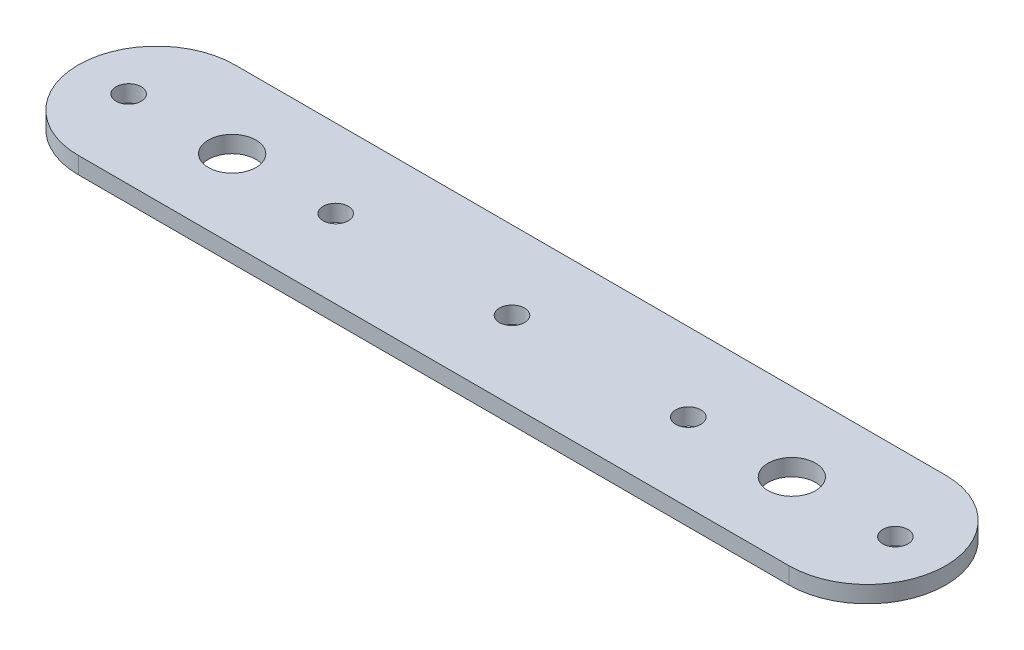
ISO-10303-21;
HEADER;
FILE_DESCRIPTION(('STEP AP214'),'2;1');
FILE_NAME('part.step','',(''),(''),'','','');
FILE_SCHEMA(('AUTOMOTIVE_DESIGN { 1 0 10303 214 1 1 1 1 }'));
ENDSEC;
DATA;
#1=APPLICATION_CONTEXT('core data for automotive mechanical design processes');
#2=APPLICATION_PROTOCOL_DEFINITION('international standard','automotive_design',2000,#1);
#3=PRODUCT_CONTEXT('',#1,'mechanical');
#4=PRODUCT('Part','Part','',(#3));
#5=PRODUCT_RELATED_PRODUCT_CATEGORY('part','',(#4));
#6=PRODUCT_DEFINITION_FORMATION('','',#4);
#7=PRODUCT_DEFINITION_CONTEXT('part definition',#1,'design');
#8=PRODUCT_DEFINITION('design','',#6,#7);
#9=PRODUCT_DEFINITION_SHAPE('','',#8);
#10=(LENGTH_UNIT() NAMED_UNIT(*) SI_UNIT(.MILLI.,.METRE.));
#11=(NAMED_UNIT(*) PLANE_ANGLE_UNIT() SI_UNIT($,.RADIAN.));
#12=(NAMED_UNIT(*) SI_UNIT($,.STERADIAN.) SOLID_ANGLE_UNIT());
#13=UNCERTAINTY_MEASURE_WITH_UNIT(LENGTH_MEASURE(1.E-05),#10,'distance_accuracy_value','');
#14=(GEOMETRIC_REPRESENTATION_CONTEXT(3) GLOBAL_UNCERTAINTY_ASSIGNED_CONTEXT((#13)) GLOBAL_UNIT_ASSIGNED_CONTEXT((#10,
#11,#12)) REPRESENTATION_CONTEXT('',''));
#15=CARTESIAN_POINT('',(0.,0.,0.));
#16=DIRECTION('',(0.,0.,1.));
#17=DIRECTION('',(1.,0.,0.));
#18=AXIS2_PLACEMENT_3D('',#15,#16,#17);
#19=CARTESIAN_POINT('',(63.5,0.,0.));
#20=DIRECTION('',(0.,-1.,0.));
#21=DIRECTION('',(0.,0.,-1.));
#22=AXIS2_PLACEMENT_3D('',#19,#20,#21);
#23=CYLINDRICAL_SURFACE('',#22,14.);
#24=DIRECTION('',(0.,1.,0.));
#25=VECTOR('',#24,1.);
#26=CARTESIAN_POINT('',(63.5,0.,14.));
#27=LINE('',#26,#25);
#28=CARTESIAN_POINT('',(63.5,0.,14.));
#29=VERTEX_POINT('',#28);
#30=CARTESIAN_POINT('',(63.5,3.,14.));
#31=VERTEX_POINT('',#30);
#32=EDGE_CURVE('E84',#29,#31,#27,.T.);
#33=ORIENTED_EDGE('',*,*,#32,.F.);
#34=CARTESIAN_POINT('',(63.5,0.,0.));
#35=DIRECTION('',(0.,1.,0.));
#36=DIRECTION('',(0.,0.,1.));
#37=AXIS2_PLACEMENT_3D('',#34,#35,#36);
#38=CIRCLE('',#37,14.);
#39=CARTESIAN_POINT('',(63.5,0.,-14.));
#40=VERTEX_POINT('',#39);
#41=EDGE_CURVE('E42',#40,#29,#38,.F.);
#42=ORIENTED_EDGE('',*,*,#41,.F.);
#43=DIRECTION('',(0.,-1.,0.));
#44=VECTOR('',#43,1.);
#45=CARTESIAN_POINT('',(63.5,3.,-14.));
#46=LINE('',#45,#44);
#47=CARTESIAN_POINT('',(63.5,3.,-14.));
#48=VERTEX_POINT('',#47);
#49=EDGE_CURVE('E107',#48,#40,#46,.T.);
#50=ORIENTED_EDGE('',*,*,#49,.F.);
#51=CARTESIAN_POINT('',(63.5,3.,0.));
#52=DIRECTION('',(0.,1.,0.));
#53=DIRECTION('',(0.,0.,1.));
#54=AXIS2_PLACEMENT_3D('',#51,#52,#53);
#55=CIRCLE('',#54,14.);
#56=EDGE_CURVE('E11',#31,#48,#55,.T.);
#57=ORIENTED_EDGE('',*,*,#56,.F.);
#58=EDGE_LOOP('',(#33,#42,#50,#57));
#59=FACE_BOUND('',#58,.T.);
#60=ADVANCED_FACE('F35',(#59),#23,.T.);
#61=CARTESIAN_POINT('',(-63.5,3.,0.));
#62=DIRECTION('',(0.,-1.,0.));
#63=DIRECTION('',(0.,0.,-1.));
#64=AXIS2_PLACEMENT_3D('',#61,#62,#63);
#65=CYLINDRICAL_SURFACE('',#64,14.);
#66=DIRECTION('',(0.,-1.,0.));
#67=VECTOR('',#66,1.);
#68=CARTESIAN_POINT('',(-63.5,3.,14.));
#69=LINE('',#68,#67);
#70=CARTESIAN_POINT('',(-63.5,3.,14.));
#71=VERTEX_POINT('',#70);
#72=CARTESIAN_POINT('',(-63.5,0.,14.));
#73=VERTEX_POINT('',#72);
#74=EDGE_CURVE('E76',#71,#73,#69,.T.);
#75=ORIENTED_EDGE('',*,*,#74,.F.);
#76=CARTESIAN_POINT('',(-63.5,3.,0.));
#77=DIRECTION('',(0.,1.,0.));
#78=DIRECTION('',(0.,0.,1.));
#79=AXIS2_PLACEMENT_3D('',#76,#77,#78);
#80=CIRCLE('',#79,14.);
#81=CARTESIAN_POINT('',(-63.5,3.,-14.));
#82=VERTEX_POINT('',#81);
#83=EDGE_CURVE('E85',#82,#71,#80,.T.);
#84=ORIENTED_EDGE('',*,*,#83,.F.);
#85=DIRECTION('',(0.,1.,0.));
#86=VECTOR('',#85,1.);
#87=CARTESIAN_POINT('',(-63.5,3.,-14.));
#88=LINE('',#87,#86);
#89=CARTESIAN_POINT('',(-63.5,0.,-14.));
#90=VERTEX_POINT('',#89);
#91=EDGE_CURVE('E79',#90,#82,#88,.T.);
#92=ORIENTED_EDGE('',*,*,#91,.F.);
#93=CARTESIAN_POINT('',(-63.5,0.,0.));
#94=DIRECTION('',(0.,1.,0.));
#95=DIRECTION('',(0.,0.,1.));
#96=AXIS2_PLACEMENT_3D('',#93,#94,#95);
#97=CIRCLE('',#96,14.);
#98=EDGE_CURVE('E73',#73,#90,#97,.F.);
#99=ORIENTED_EDGE('',*,*,#98,.F.);
#100=EDGE_LOOP('',(#75,#84,#92,#99));
#101=FACE_BOUND('',#100,.T.);
#102=ADVANCED_FACE('F75',(#101),#65,.T.);
#103=CARTESIAN_POINT('',(0.,3.,-14.));
#104=DIRECTION('',(0.,0.,-1.));
#105=DIRECTION('',(-1.,0.,0.));
#106=AXIS2_PLACEMENT_3D('',#103,#104,#105);
#107=PLANE('',#106);
#108=DIRECTION('',(1.,0.,0.));
#109=VECTOR('',#108,1.);
#110=CARTESIAN_POINT('',(0.,3.,-14.));
#111=LINE('',#110,#109);
#112=EDGE_CURVE('E95',#82,#48,#111,.T.);
#113=ORIENTED_EDGE('',*,*,#112,.T.);
#114=ORIENTED_EDGE('',*,*,#49,.T.);
#115=DIRECTION('',(1.,0.,0.));
#116=VECTOR('',#115,1.);
#117=CARTESIAN_POINT('',(0.,0.,-14.));
#118=LINE('',#117,#116);
#119=EDGE_CURVE('E96',#90,#40,#118,.T.);
#120=ORIENTED_EDGE('',*,*,#119,.F.);
#121=ORIENTED_EDGE('',*,*,#91,.T.);
#122=EDGE_LOOP('',(#113,#114,#120,#121));
#123=FACE_BOUND('',#122,.T.);
#124=ADVANCED_FACE('F109',(#123),#107,.T.);
#125=CARTESIAN_POINT('',(0.,3.,14.));
#126=DIRECTION('',(0.,0.,-1.));
#127=DIRECTION('',(-1.,0.,0.));
#128=AXIS2_PLACEMENT_3D('',#125,#126,#127);
#129=PLANE('',#128);
#130=DIRECTION('',(1.,0.,0.));
#131=VECTOR('',#130,1.);
#132=CARTESIAN_POINT('',(0.,0.,14.));
#133=LINE('',#132,#131);
#134=EDGE_CURVE('E91',#73,#29,#133,.T.);
#135=ORIENTED_EDGE('',*,*,#134,.T.);
#136=ORIENTED_EDGE('',*,*,#32,.T.);
#137=DIRECTION('',(1.,0.,0.));
#138=VECTOR('',#137,1.);
#139=CARTESIAN_POINT('',(0.,3.,14.));
#140=LINE('',#139,#138);
#141=EDGE_CURVE('E92',#71,#31,#140,.T.);
#142=ORIENTED_EDGE('',*,*,#141,.F.);
#143=ORIENTED_EDGE('',*,*,#74,.T.);
#144=EDGE_LOOP('',(#135,#136,#142,#143));
#145=FACE_BOUND('',#144,.T.);
#146=ADVANCED_FACE('F89',(#145),#129,.F.);
#147=CARTESIAN_POINT('',(0.,3.,0.));
#148=DIRECTION('',(0.,1.,0.));
#149=DIRECTION('',(0.,0.,1.));
#150=AXIS2_PLACEMENT_3D('',#147,#148,#149);
#151=PLANE('',#150);
#152=CARTESIAN_POINT('',(68.5,3.,0.));
#153=DIRECTION('',(0.,1.,0.));
#154=DIRECTION('',(0.,0.,1.));
#155=AXIS2_PLACEMENT_3D('',#152,#153,#154);
#156=CIRCLE('',#155,2.25);
#157=CARTESIAN_POINT('',(68.5,3.,2.25));
#158=VERTEX_POINT('',#157);
#159=EDGE_CURVE('E150',#158,#158,#156,.T.);
#160=ORIENTED_EDGE('',*,*,#159,.F.);
#161=EDGE_LOOP('',(#160));
#162=FACE_BOUND('',#161,.T.);
#163=CARTESIAN_POINT('',(31.5,3.,0.));
#164=DIRECTION('',(0.,1.,0.));
#165=DIRECTION('',(0.,0.,1.));
#166=AXIS2_PLACEMENT_3D('',#163,#164,#165);
#167=CIRCLE('',#166,2.25);
#168=CARTESIAN_POINT('',(31.5,3.,2.25));
#169=VERTEX_POINT('',#168);
#170=EDGE_CURVE('E144',#169,#169,#167,.T.);
#171=ORIENTED_EDGE('',*,*,#170,.F.);
#172=EDGE_LOOP('',(#171));
#173=FACE_BOUND('',#172,.T.);
#174=CARTESIAN_POINT('',(-31.5,3.,0.));
#175=DIRECTION('',(0.,1.,0.));
#176=DIRECTION('',(0.,0.,1.));
#177=AXIS2_PLACEMENT_3D('',#174,#175,#176);
#178=CIRCLE('',#177,2.25);
#179=CARTESIAN_POINT('',(-31.5,3.,2.25));
#180=VERTEX_POINT('',#179);
#181=EDGE_CURVE('E138',#180,#180,#178,.T.);
#182=ORIENTED_EDGE('',*,*,#181,.F.);
#183=EDGE_LOOP('',(#182));
#184=FACE_BOUND('',#183,.T.);
#185=CARTESIAN_POINT('',(-68.5,3.,0.));
#186=DIRECTION('',(0.,1.,0.));
#187=DIRECTION('',(0.,0.,1.));
#188=AXIS2_PLACEMENT_3D('',#185,#186,#187);
#189=CIRCLE('',#188,2.25);
#190=CARTESIAN_POINT('',(-68.5,3.,2.25));
#191=VERTEX_POINT('',#190);
#192=EDGE_CURVE('E132',#191,#191,#189,.T.);
#193=ORIENTED_EDGE('',*,*,#192,.F.);
#194=EDGE_LOOP('',(#193));
#195=FACE_BOUND('',#194,.T.);
#196=CARTESIAN_POINT('',(0.,3.,0.));
#197=DIRECTION('',(0.,1.,0.));
#198=DIRECTION('',(0.,0.,1.));
#199=AXIS2_PLACEMENT_3D('',#196,#197,#198);
#200=CIRCLE('',#199,2.25);
#201=CARTESIAN_POINT('',(0.,3.,2.25));
#202=VERTEX_POINT('',#201);
#203=EDGE_CURVE('E126',#202,#202,#200,.T.);
#204=ORIENTED_EDGE('',*,*,#203,.F.);
#205=EDGE_LOOP('',(#204));
#206=FACE_BOUND('',#205,.T.);
#207=CARTESIAN_POINT('',(50.,3.,0.));
#208=DIRECTION('',(0.,1.,0.));
#209=DIRECTION('',(0.,0.,1.));
#210=AXIS2_PLACEMENT_3D('',#207,#208,#209);
#211=CIRCLE('',#210,4.25000000000001);
#212=CARTESIAN_POINT('',(50.,3.,4.25000000000001));
#213=VERTEX_POINT('',#212);
#214=EDGE_CURVE('E120',#213,#213,#211,.T.);
#215=ORIENTED_EDGE('',*,*,#214,.F.);
#216=EDGE_LOOP('',(#215));
#217=FACE_BOUND('',#216,.T.);
#218=CARTESIAN_POINT('',(-50.,3.,0.));
#219=DIRECTION('',(0.,1.,0.));
#220=DIRECTION('',(0.,0.,1.));
#221=AXIS2_PLACEMENT_3D('',#218,#219,#220);
#222=CIRCLE('',#221,4.25000000000001);
#223=CARTESIAN_POINT('',(-50.,3.,4.25000000000001));
#224=VERTEX_POINT('',#223);
#225=EDGE_CURVE('E114',#224,#224,#222,.T.);
#226=ORIENTED_EDGE('',*,*,#225,.F.);
#227=EDGE_LOOP('',(#226));
#228=FACE_BOUND('',#227,.T.);
#229=ORIENTED_EDGE('',*,*,#141,.T.);
#230=ORIENTED_EDGE('',*,*,#56,.T.);
#231=ORIENTED_EDGE('',*,*,#112,.F.);
#232=ORIENTED_EDGE('',*,*,#83,.T.);
#233=EDGE_LOOP('',(#229,#230,#231,#232));
#234=FACE_BOUND('',#233,.T.);
#235=ADVANCED_FACE('F110',(#162,#173,#184,#195,#206,#217,#228,#234),#151,.T.);
#236=CARTESIAN_POINT('',(0.,0.,0.));
#237=DIRECTION('',(0.,1.,0.));
#238=DIRECTION('',(0.,0.,1.));
#239=AXIS2_PLACEMENT_3D('',#236,#237,#238);
#240=PLANE('',#239);
#241=CARTESIAN_POINT('',(68.5,0.,0.));
#242=DIRECTION('',(0.,1.,0.));
#243=DIRECTION('',(0.,0.,1.));
#244=AXIS2_PLACEMENT_3D('',#241,#242,#243);
#245=CIRCLE('',#244,2.25);
#246=CARTESIAN_POINT('',(68.5,0.,2.25));
#247=VERTEX_POINT('',#246);
#248=EDGE_CURVE('E147',#247,#247,#245,.F.);
#249=ORIENTED_EDGE('',*,*,#248,.F.);
#250=EDGE_LOOP('',(#249));
#251=FACE_BOUND('',#250,.T.);
#252=CARTESIAN_POINT('',(31.5,0.,0.));
#253=DIRECTION('',(0.,1.,0.));
#254=DIRECTION('',(0.,0.,1.));
#255=AXIS2_PLACEMENT_3D('',#252,#253,#254);
#256=CIRCLE('',#255,2.25);
#257=CARTESIAN_POINT('',(31.5,0.,2.25));
#258=VERTEX_POINT('',#257);
#259=EDGE_CURVE('E141',#258,#258,#256,.F.);
#260=ORIENTED_EDGE('',*,*,#259,.F.);
#261=EDGE_LOOP('',(#260));
#262=FACE_BOUND('',#261,.T.);
#263=CARTESIAN_POINT('',(-31.5,0.,0.));
#264=DIRECTION('',(0.,1.,0.));
#265=DIRECTION('',(0.,0.,1.));
#266=AXIS2_PLACEMENT_3D('',#263,#264,#265);
#267=CIRCLE('',#266,2.25);
#268=CARTESIAN_POINT('',(-31.5,0.,2.25));
#269=VERTEX_POINT('',#268);
#270=EDGE_CURVE('E135',#269,#269,#267,.F.);
#271=ORIENTED_EDGE('',*,*,#270,.F.);
#272=EDGE_LOOP('',(#271));
#273=FACE_BOUND('',#272,.T.);
#274=CARTESIAN_POINT('',(-68.5,0.,0.));
#275=DIRECTION('',(0.,1.,0.));
#276=DIRECTION('',(0.,0.,1.));
#277=AXIS2_PLACEMENT_3D('',#274,#275,#276);
#278=CIRCLE('',#277,2.25);
#279=CARTESIAN_POINT('',(-68.5,0.,2.25));
#280=VERTEX_POINT('',#279);
#281=EDGE_CURVE('E129',#280,#280,#278,.F.);
#282=ORIENTED_EDGE('',*,*,#281,.F.);
#283=EDGE_LOOP('',(#282));
#284=FACE_BOUND('',#283,.T.);
#285=CARTESIAN_POINT('',(0.,0.,0.));
#286=DIRECTION('',(0.,1.,0.));
#287=DIRECTION('',(0.,0.,1.));
#288=AXIS2_PLACEMENT_3D('',#285,#286,#287);
#289=CIRCLE('',#288,2.25);
#290=CARTESIAN_POINT('',(0.,0.,2.25));
#291=VERTEX_POINT('',#290);
#292=EDGE_CURVE('E123',#291,#291,#289,.F.);
#293=ORIENTED_EDGE('',*,*,#292,.F.);
#294=EDGE_LOOP('',(#293));
#295=FACE_BOUND('',#294,.T.);
#296=CARTESIAN_POINT('',(50.,0.,0.));
#297=DIRECTION('',(0.,1.,0.));
#298=DIRECTION('',(0.,0.,1.));
#299=AXIS2_PLACEMENT_3D('',#296,#297,#298);
#300=CIRCLE('',#299,4.25000000000001);
#301=CARTESIAN_POINT('',(50.,0.,4.25000000000001));
#302=VERTEX_POINT('',#301);
#303=EDGE_CURVE('E117',#302,#302,#300,.F.);
#304=ORIENTED_EDGE('',*,*,#303,.F.);
#305=EDGE_LOOP('',(#304));
#306=FACE_BOUND('',#305,.T.);
#307=CARTESIAN_POINT('',(-50.,0.,0.));
#308=DIRECTION('',(0.,1.,0.));
#309=DIRECTION('',(0.,0.,1.));
#310=AXIS2_PLACEMENT_3D('',#307,#308,#309);
#311=CIRCLE('',#310,4.25000000000001);
#312=CARTESIAN_POINT('',(-50.,0.,4.25000000000001));
#313=VERTEX_POINT('',#312);
#314=EDGE_CURVE('E100',#313,#313,#311,.F.);
#315=ORIENTED_EDGE('',*,*,#314,.F.);
#316=EDGE_LOOP('',(#315));
#317=FACE_BOUND('',#316,.T.);
#318=ORIENTED_EDGE('',*,*,#119,.T.);
#319=ORIENTED_EDGE('',*,*,#41,.T.);
#320=ORIENTED_EDGE('',*,*,#134,.F.);
#321=ORIENTED_EDGE('',*,*,#98,.T.);
#322=EDGE_LOOP('',(#318,#319,#320,#321));
#323=FACE_BOUND('',#322,.T.);
#324=ADVANCED_FACE('F94',(#251,#262,#273,#284,#295,#306,#317,#323),#240,.F.);
#325=CARTESIAN_POINT('',(-50.,-0.00100000000000013,0.));
#326=DIRECTION('',(0.,1.,0.));
#327=DIRECTION('',(0.,0.,1.));
#328=AXIS2_PLACEMENT_3D('',#325,#326,#327);
#329=CYLINDRICAL_SURFACE('',#328,4.25000000000001);
#330=CARTESIAN_POINT('',(-50.,3.,4.25000000000001));
#331=CARTESIAN_POINT('',(-50.,2.96875,4.25000000000001));
#332=CARTESIAN_POINT('',(-50.,2.9375,4.25000000000001));
#333=CARTESIAN_POINT('',(-50.,2.875,4.25000000000001));
#334=CARTESIAN_POINT('',(-50.,2.84375,4.25000000000001));
#335=CARTESIAN_POINT('',(-50.,2.78125,4.25000000000001));
#336=CARTESIAN_POINT('',(-50.,2.75,4.25000000000001));
#337=CARTESIAN_POINT('',(-50.,2.6875,4.25000000000001));
#338=CARTESIAN_POINT('',(-50.,2.65625,4.25000000000001));
#339=CARTESIAN_POINT('',(-50.,2.59375,4.25000000000001));
#340=CARTESIAN_POINT('',(-50.,2.5625,4.25000000000001));
#341=CARTESIAN_POINT('',(-50.,2.5,4.25000000000001));
#342=CARTESIAN_POINT('',(-50.,2.46875,4.25000000000001));
#343=CARTESIAN_POINT('',(-50.,2.40625,4.25000000000001));
#344=CARTESIAN_POINT('',(-50.,2.375,4.25000000000001));
#345=CARTESIAN_POINT('',(-50.,2.3125,4.25000000000001));
#346=CARTESIAN_POINT('',(-50.,2.28125,4.25000000000001));
#347=CARTESIAN_POINT('',(-50.,2.21875,4.25000000000001));
#348=CARTESIAN_POINT('',(-50.,2.1875,4.25000000000001));
#349=CARTESIAN_POINT('',(-50.,2.125,4.25000000000001));
#350=CARTESIAN_POINT('',(-50.,2.09375,4.25000000000001));
#351=CARTESIAN_POINT('',(-50.,2.03125,4.25000000000001));
#352=CARTESIAN_POINT('',(-50.,2.,4.25000000000001));
#353=CARTESIAN_POINT('',(-50.,1.9375,4.25000000000001));
#354=CARTESIAN_POINT('',(-50.,1.90625,4.25000000000001));
#355=CARTESIAN_POINT('',(-50.,1.84375,4.25000000000001));
#356=CARTESIAN_POINT('',(-50.,1.8125,4.25000000000001));
#357=CARTESIAN_POINT('',(-50.,1.75,4.25000000000001));
#358=CARTESIAN_POINT('',(-50.,1.71875,4.25000000000001));
#359=CARTESIAN_POINT('',(-50.,1.65625,4.25000000000001));
#360=CARTESIAN_POINT('',(-50.,1.625,4.25000000000001));
#361=CARTESIAN_POINT('',(-50.,1.5625,4.25000000000001));
#362=CARTESIAN_POINT('',(-50.,1.53125,4.25000000000001));
#363=CARTESIAN_POINT('',(-50.,1.46875,4.25000000000001));
#364=CARTESIAN_POINT('',(-50.,1.4375,4.25000000000001));
#365=CARTESIAN_POINT('',(-50.,1.375,4.25000000000001));
#366=CARTESIAN_POINT('',(-50.,1.34375,4.25000000000001));
#367=CARTESIAN_POINT('',(-50.,1.28125,4.25000000000001));
#368=CARTESIAN_POINT('',(-50.,1.25,4.25000000000001));
#369=CARTESIAN_POINT('',(-50.,1.1875,4.25000000000001));
#370=CARTESIAN_POINT('',(-50.,1.15625,4.25000000000001));
#371=CARTESIAN_POINT('',(-50.,1.09375,4.25000000000001));
#372=CARTESIAN_POINT('',(-50.,1.0625,4.25000000000001));
#373=CARTESIAN_POINT('',(-50.,1.,4.25000000000001));
#374=CARTESIAN_POINT('',(-50.,0.96875,4.25000000000001));
#375=CARTESIAN_POINT('',(-50.,0.90625,4.25000000000001));
#376=CARTESIAN_POINT('',(-50.,0.875,4.25000000000001));
#377=CARTESIAN_POINT('',(-50.,0.8125,4.25000000000001));
#378=CARTESIAN_POINT('',(-50.,0.78125,4.25000000000001));
#379=CARTESIAN_POINT('',(-50.,0.71875,4.25000000000001));
#380=CARTESIAN_POINT('',(-50.,0.6875,4.25000000000001));
#381=CARTESIAN_POINT('',(-50.,0.625,4.25000000000001));
#382=CARTESIAN_POINT('',(-50.,0.59375,4.25000000000001));
#383=CARTESIAN_POINT('',(-50.,0.53125,4.25000000000001));
#384=CARTESIAN_POINT('',(-50.,0.5,4.25000000000001));
#385=CARTESIAN_POINT('',(-50.,0.4375,4.25000000000001));
#386=CARTESIAN_POINT('',(-50.,0.40625,4.25000000000001));
#387=CARTESIAN_POINT('',(-50.,0.34375,4.25000000000001));
#388=CARTESIAN_POINT('',(-50.,0.3125,4.25000000000001));
#389=CARTESIAN_POINT('',(-50.,0.25,4.25000000000001));
#390=CARTESIAN_POINT('',(-50.,0.21875,4.25000000000001));
#391=CARTESIAN_POINT('',(-50.,0.15625,4.25000000000001));
#392=CARTESIAN_POINT('',(-50.,0.125,4.25000000000001));
#393=CARTESIAN_POINT('',(-50.,0.0625000000000001,4.25000000000001));
#394=CARTESIAN_POINT('',(-50.,0.0312500000000001,4.25000000000001));
#395=CARTESIAN_POINT('',(-50.,0.,4.25000000000001));
#396=B_SPLINE_CURVE_WITH_KNOTS('',3,(#330,#331,#332,#333,#334,#335,#336,#337,#338,#339,#340,
#341,#342,#343,#344,#345,#346,#347,#348,#349,#350,#351,#352,#353,#354,#355,#356,#357,#358,#359,
#360,#361,#362,#363,#364,#365,#366,#367,#368,#369,#370,#371,#372,#373,#374,#375,#376,#377,#378,
#379,#380,#381,#382,#383,#384,#385,#386,#387,#388,#389,#390,#391,#392,#393,#394,#395),
.UNSPECIFIED.,.F.,.F.,(4,2,2,2,2,2,2,2,2,2,2,2,2,2,2,2,2,2,2,2,2,2,2,2,2,2,2,2,2,2,2,2,4),(0.,
0.0937500000000001,0.1875,0.28125,0.375,0.46875,0.5625,0.65625,0.75,0.84375,0.9375,1.03125,
1.125,1.21875,1.3125,1.40625,1.5,1.59375,1.6875,1.78125,1.875,1.96875,2.0625,2.15625,2.25,
2.34375,2.4375,2.53125,2.625,2.71875,2.8125,2.90625,3.),.UNSPECIFIED.);
#397=EDGE_CURVE('BSEAM172',#224,#313,#396,.T.);
#398=ORIENTED_EDGE('',*,*,#225,.T.);
#399=ORIENTED_EDGE('',*,*,#314,.T.);
#400=ORIENTED_EDGE('',*,*,#397,.T.);
#401=ORIENTED_EDGE('',*,*,#397,.F.);
#402=EDGE_LOOP('',(#398,#400,#399,#401));
#403=FACE_BOUND('',#402,.T.);
#404=ADVANCED_FACE('F172',(#403),#329,.F.);
#405=CARTESIAN_POINT('',(50.,-0.00100000000000013,0.));
#406=DIRECTION('',(0.,1.,0.));
#407=DIRECTION('',(0.,0.,1.));
#408=AXIS2_PLACEMENT_3D('',#405,#406,#407);
#409=CYLINDRICAL_SURFACE('',#408,4.25000000000001);
#410=CARTESIAN_POINT('',(50.,3.,4.25000000000001));
#411=CARTESIAN_POINT('',(50.,2.96875,4.25000000000001));
#412=CARTESIAN_POINT('',(50.,2.9375,4.25000000000001));
#413=CARTESIAN_POINT('',(50.,2.875,4.25000000000001));
#414=CARTESIAN_POINT('',(50.,2.84375,4.25000000000001));
#415=CARTESIAN_POINT('',(50.,2.78125,4.25000000000001));
#416=CARTESIAN_POINT('',(50.,2.75,4.25000000000001));
#417=CARTESIAN_POINT('',(50.,2.6875,4.25000000000001));
#418=CARTESIAN_POINT('',(50.,2.65625,4.25000000000001));
#419=CARTESIAN_POINT('',(50.,2.59375,4.25000000000001));
#420=CARTESIAN_POINT('',(50.,2.5625,4.25000000000001));
#421=CARTESIAN_POINT('',(50.,2.5,4.25000000000001));
#422=CARTESIAN_POINT('',(50.,2.46875,4.25000000000001));
#423=CARTESIAN_POINT('',(50.,2.40625,4.25000000000001));
#424=CARTESIAN_POINT('',(50.,2.375,4.25000000000001));
#425=CARTESIAN_POINT('',(50.,2.3125,4.25000000000001));
#426=CARTESIAN_POINT('',(50.,2.28125,4.25000000000001));
#427=CARTESIAN_POINT('',(50.,2.21875,4.25000000000001));
#428=CARTESIAN_POINT('',(50.,2.1875,4.25000000000001));
#429=CARTESIAN_POINT('',(50.,2.125,4.25000000000001));
#430=CARTESIAN_POINT('',(50.,2.09375,4.25000000000001));
#431=CARTESIAN_POINT('',(50.,2.03125,4.25000000000001));
#432=CARTESIAN_POINT('',(50.,2.,4.25000000000001));
#433=CARTESIAN_POINT('',(50.,1.9375,4.25000000000001));
#434=CARTESIAN_POINT('',(50.,1.90625,4.25000000000001));
#435=CARTESIAN_POINT('',(50.,1.84375,4.25000000000001));
#436=CARTESIAN_POINT('',(50.,1.8125,4.25000000000001));
#437=CARTESIAN_POINT('',(50.,1.75,4.25000000000001));
#438=CARTESIAN_POINT('',(50.,1.71875,4.25000000000001));
#439=CARTESIAN_POINT('',(50.,1.65625,4.25000000000001));
#440=CARTESIAN_POINT('',(50.,1.625,4.25000000000001));
#441=CARTESIAN_POINT('',(50.,1.5625,4.25000000000001));
#442=CARTESIAN_POINT('',(50.,1.53125,4.25000000000001));
#443=CARTESIAN_POINT('',(50.,1.46875,4.25000000000001));
#444=CARTESIAN_POINT('',(50.,1.4375,4.25000000000001));
#445=CARTESIAN_POINT('',(50.,1.375,4.25000000000001));
#446=CARTESIAN_POINT('',(50.,1.34375,4.25000000000001));
#447=CARTESIAN_POINT('',(50.,1.28125,4.25000000000001));
#448=CARTESIAN_POINT('',(50.,1.25,4.25000000000001));
#449=CARTESIAN_POINT('',(50.,1.1875,4.25000000000001));
#450=CARTESIAN_POINT('',(50.,1.15625,4.25000000000001));
#451=CARTESIAN_POINT('',(50.,1.09375,4.25000000000001));
#452=CARTESIAN_POINT('',(50.,1.0625,4.25000000000001));
#453=CARTESIAN_POINT('',(50.,1.,4.25000000000001));
#454=CARTESIAN_POINT('',(50.,0.96875,4.25000000000001));
#455=CARTESIAN_POINT('',(50.,0.90625,4.25000000000001));
#456=CARTESIAN_POINT('',(50.,0.875,4.25000000000001));
#457=CARTESIAN_POINT('',(50.,0.8125,4.25000000000001));
#458=CARTESIAN_POINT('',(50.,0.78125,4.25000000000001));
#459=CARTESIAN_POINT('',(50.,0.71875,4.25000000000001));
#460=CARTESIAN_POINT('',(50.,0.6875,4.25000000000001));
#461=CARTESIAN_POINT('',(50.,0.625,4.25000000000001));
#462=CARTESIAN_POINT('',(50.,0.59375,4.25000000000001));
#463=CARTESIAN_POINT('',(50.,0.53125,4.25000000000001));
#464=CARTESIAN_POINT('',(50.,0.5,4.25000000000001));
#465=CARTESIAN_POINT('',(50.,0.4375,4.25000000000001));
#466=CARTESIAN_POINT('',(50.,0.40625,4.25000000000001));
#467=CARTESIAN_POINT('',(50.,0.34375,4.25000000000001));
#468=CARTESIAN_POINT('',(50.,0.3125,4.25000000000001));
#469=CARTESIAN_POINT('',(50.,0.25,4.25000000000001));
#470=CARTESIAN_POINT('',(50.,0.21875,4.25000000000001));
#471=CARTESIAN_POINT('',(50.,0.15625,4.25000000000001));
#472=CARTESIAN_POINT('',(50.,0.125,4.25000000000001));
#473=CARTESIAN_POINT('',(50.,0.0625000000000001,4.25000000000001));
#474=CARTESIAN_POINT('',(50.,0.0312500000000001,4.25000000000001));
#475=CARTESIAN_POINT('',(50.,0.,4.25000000000001));
#476=B_SPLINE_CURVE_WITH_KNOTS('',3,(#410,#411,#412,#413,#414,#415,#416,#417,#418,#419,#420,
#421,#422,#423,#424,#425,#426,#427,#428,#429,#430,#431,#432,#433,#434,#435,#436,#437,#438,#439,
#440,#441,#442,#443,#444,#445,#446,#447,#448,#449,#450,#451,#452,#453,#454,#455,#456,#457,#458,
#459,#460,#461,#462,#463,#464,#465,#466,#467,#468,#469,#470,#471,#472,#473,#474,#475),
.UNSPECIFIED.,.F.,.F.,(4,2,2,2,2,2,2,2,2,2,2,2,2,2,2,2,2,2,2,2,2,2,2,2,2,2,2,2,2,2,2,2,4),(0.,
0.0937500000000001,0.1875,0.28125,0.375,0.46875,0.5625,0.65625,0.75,0.84375,0.9375,1.03125,
1.125,1.21875,1.3125,1.40625,1.5,1.59375,1.6875,1.78125,1.875,1.96875,2.0625,2.15625,2.25,
2.34375,2.4375,2.53125,2.625,2.71875,2.8125,2.90625,3.),.UNSPECIFIED.);
#477=EDGE_CURVE('BSEAM175',#213,#302,#476,.T.);
#478=ORIENTED_EDGE('',*,*,#214,.T.);
#479=ORIENTED_EDGE('',*,*,#303,.T.);
#480=ORIENTED_EDGE('',*,*,#477,.T.);
#481=ORIENTED_EDGE('',*,*,#477,.F.);
#482=EDGE_LOOP('',(#478,#480,#479,#481));
#483=FACE_BOUND('',#482,.T.);
#484=ADVANCED_FACE('F175',(#483),#409,.F.);
#485=CARTESIAN_POINT('',(0.,-0.00100000000000013,0.));
#486=DIRECTION('',(0.,1.,0.));
#487=DIRECTION('',(0.,0.,1.));
#488=AXIS2_PLACEMENT_3D('',#485,#486,#487);
#489=CYLINDRICAL_SURFACE('',#488,2.25);
#490=CARTESIAN_POINT('',(0.,3.,2.25));
#491=CARTESIAN_POINT('',(0.,2.96875,2.25));
#492=CARTESIAN_POINT('',(0.,2.9375,2.25));
#493=CARTESIAN_POINT('',(0.,2.875,2.25));
#494=CARTESIAN_POINT('',(0.,2.84375,2.25));
#495=CARTESIAN_POINT('',(0.,2.78125,2.25));
#496=CARTESIAN_POINT('',(0.,2.75,2.25));
#497=CARTESIAN_POINT('',(0.,2.6875,2.25));
#498=CARTESIAN_POINT('',(0.,2.65625,2.25));
#499=CARTESIAN_POINT('',(0.,2.59375,2.25));
#500=CARTESIAN_POINT('',(0.,2.5625,2.25));
#501=CARTESIAN_POINT('',(0.,2.5,2.25));
#502=CARTESIAN_POINT('',(0.,2.46875,2.25));
#503=CARTESIAN_POINT('',(0.,2.40625,2.25));
#504=CARTESIAN_POINT('',(0.,2.375,2.25));
#505=CARTESIAN_POINT('',(0.,2.3125,2.25));
#506=CARTESIAN_POINT('',(0.,2.28125,2.25));
#507=CARTESIAN_POINT('',(0.,2.21875,2.25));
#508=CARTESIAN_POINT('',(0.,2.1875,2.25));
#509=CARTESIAN_POINT('',(0.,2.125,2.25));
#510=CARTESIAN_POINT('',(0.,2.09375,2.25));
#511=CARTESIAN_POINT('',(0.,2.03125,2.25));
#512=CARTESIAN_POINT('',(0.,2.,2.25));
#513=CARTESIAN_POINT('',(0.,1.9375,2.25));
#514=CARTESIAN_POINT('',(0.,1.90625,2.25));
#515=CARTESIAN_POINT('',(0.,1.84375,2.25));
#516=CARTESIAN_POINT('',(0.,1.8125,2.25));
#517=CARTESIAN_POINT('',(0.,1.75,2.25));
#518=CARTESIAN_POINT('',(0.,1.71875,2.25));
#519=CARTESIAN_POINT('',(0.,1.65625,2.25));
#520=CARTESIAN_POINT('',(0.,1.625,2.25));
#521=CARTESIAN_POINT('',(0.,1.5625,2.25));
#522=CARTESIAN_POINT('',(0.,1.53125,2.25));
#523=CARTESIAN_POINT('',(0.,1.46875,2.25));
#524=CARTESIAN_POINT('',(0.,1.4375,2.25));
#525=CARTESIAN_POINT('',(0.,1.375,2.25));
#526=CARTESIAN_POINT('',(0.,1.34375,2.25));
#527=CARTESIAN_POINT('',(0.,1.28125,2.25));
#528=CARTESIAN_POINT('',(0.,1.25,2.25));
#529=CARTESIAN_POINT('',(0.,1.1875,2.25));
#530=CARTESIAN_POINT('',(0.,1.15625,2.25));
#531=CARTESIAN_POINT('',(0.,1.09375,2.25));
#532=CARTESIAN_POINT('',(0.,1.0625,2.25));
#533=CARTESIAN_POINT('',(0.,1.,2.25));
#534=CARTESIAN_POINT('',(0.,0.96875,2.25));
#535=CARTESIAN_POINT('',(0.,0.90625,2.25));
#536=CARTESIAN_POINT('',(0.,0.875,2.25));
#537=CARTESIAN_POINT('',(0.,0.8125,2.25));
#538=CARTESIAN_POINT('',(0.,0.78125,2.25));
#539=CARTESIAN_POINT('',(0.,0.71875,2.25));
#540=CARTESIAN_POINT('',(0.,0.6875,2.25));
#541=CARTESIAN_POINT('',(0.,0.625,2.25));
#542=CARTESIAN_POINT('',(0.,0.59375,2.25));
#543=CARTESIAN_POINT('',(0.,0.53125,2.25));
#544=CARTESIAN_POINT('',(0.,0.5,2.25));
#545=CARTESIAN_POINT('',(0.,0.4375,2.25));
#546=CARTESIAN_POINT('',(0.,0.40625,2.25));
#547=CARTESIAN_POINT('',(0.,0.34375,2.25));
#548=CARTESIAN_POINT('',(0.,0.3125,2.25));
#549=CARTESIAN_POINT('',(0.,0.25,2.25));
#550=CARTESIAN_POINT('',(0.,0.21875,2.25));
#551=CARTESIAN_POINT('',(0.,0.15625,2.25));
#552=CARTESIAN_POINT('',(0.,0.125,2.25));
#553=CARTESIAN_POINT('',(0.,0.0625000000000001,2.25));
#554=CARTESIAN_POINT('',(0.,0.0312500000000001,2.25));
#555=CARTESIAN_POINT('',(0.,0.,2.25));
#556=B_SPLINE_CURVE_WITH_KNOTS('',3,(#490,#491,#492,#493,#494,#495,#496,#497,#498,#499,#500,
#501,#502,#503,#504,#505,#506,#507,#508,#509,#510,#511,#512,#513,#514,#515,#516,#517,#518,#519,
#520,#521,#522,#523,#524,#525,#526,#527,#528,#529,#530,#531,#532,#533,#534,#535,#536,#537,#538,
#539,#540,#541,#542,#543,#544,#545,#546,#547,#548,#549,#550,#551,#552,#553,#554,#555),
.UNSPECIFIED.,.F.,.F.,(4,2,2,2,2,2,2,2,2,2,2,2,2,2,2,2,2,2,2,2,2,2,2,2,2,2,2,2,2,2,2,2,4),(0.,
0.0937500000000001,0.1875,0.28125,0.375,0.46875,0.5625,0.65625,0.75,0.84375,0.9375,1.03125,
1.125,1.21875,1.3125,1.40625,1.5,1.59375,1.6875,1.78125,1.875,1.96875,2.0625,2.15625,2.25,
2.34375,2.4375,2.53125,2.625,2.71875,2.8125,2.90625,3.),.UNSPECIFIED.);
#557=EDGE_CURVE('BSEAM224',#202,#291,#556,.T.);
#558=ORIENTED_EDGE('',*,*,#203,.T.);
#559=ORIENTED_EDGE('',*,*,#292,.T.);
#560=ORIENTED_EDGE('',*,*,#557,.T.);
#561=ORIENTED_EDGE('',*,*,#557,.F.);
#562=EDGE_LOOP('',(#558,#560,#559,#561));
#563=FACE_BOUND('',#562,.T.);
#564=ADVANCED_FACE('F224',(#563),#489,.F.);
#565=CARTESIAN_POINT('',(-68.5,-0.00100000000000013,0.));
#566=DIRECTION('',(0.,1.,0.));
#567=DIRECTION('',(0.,0.,1.));
#568=AXIS2_PLACEMENT_3D('',#565,#566,#567);
#569=CYLINDRICAL_SURFACE('',#568,2.25);
#570=CARTESIAN_POINT('',(-68.5,3.,2.25));
#571=CARTESIAN_POINT('',(-68.5,2.96875,2.25));
#572=CARTESIAN_POINT('',(-68.5,2.9375,2.25));
#573=CARTESIAN_POINT('',(-68.5,2.875,2.25));
#574=CARTESIAN_POINT('',(-68.5,2.84375,2.25));
#575=CARTESIAN_POINT('',(-68.5,2.78125,2.25));
#576=CARTESIAN_POINT('',(-68.5,2.75,2.25));
#577=CARTESIAN_POINT('',(-68.5,2.6875,2.25));
#578=CARTESIAN_POINT('',(-68.5,2.65625,2.25));
#579=CARTESIAN_POINT('',(-68.5,2.59375,2.25));
#580=CARTESIAN_POINT('',(-68.5,2.5625,2.25));
#581=CARTESIAN_POINT('',(-68.5,2.5,2.25));
#582=CARTESIAN_POINT('',(-68.5,2.46875,2.25));
#583=CARTESIAN_POINT('',(-68.5,2.40625,2.25));
#584=CARTESIAN_POINT('',(-68.5,2.375,2.25));
#585=CARTESIAN_POINT('',(-68.5,2.3125,2.25));
#586=CARTESIAN_POINT('',(-68.5,2.28125,2.25));
#587=CARTESIAN_POINT('',(-68.5,2.21875,2.25));
#588=CARTESIAN_POINT('',(-68.5,2.1875,2.25));
#589=CARTESIAN_POINT('',(-68.5,2.125,2.25));
#590=CARTESIAN_POINT('',(-68.5,2.09375,2.25));
#591=CARTESIAN_POINT('',(-68.5,2.03125,2.25));
#592=CARTESIAN_POINT('',(-68.5,2.,2.25));
#593=CARTESIAN_POINT('',(-68.5,1.9375,2.25));
#594=CARTESIAN_POINT('',(-68.5,1.90625,2.25));
#595=CARTESIAN_POINT('',(-68.5,1.84375,2.25));
#596=CARTESIAN_POINT('',(-68.5,1.8125,2.25));
#597=CARTESIAN_POINT('',(-68.5,1.75,2.25));
#598=CARTESIAN_POINT('',(-68.5,1.71875,2.25));
#599=CARTESIAN_POINT('',(-68.5,1.65625,2.25));
#600=CARTESIAN_POINT('',(-68.5,1.625,2.25));
#601=CARTESIAN_POINT('',(-68.5,1.5625,2.25));
#602=CARTESIAN_POINT('',(-68.5,1.53125,2.25));
#603=CARTESIAN_POINT('',(-68.5,1.46875,2.25));
#604=CARTESIAN_POINT('',(-68.5,1.4375,2.25));
#605=CARTESIAN_POINT('',(-68.5,1.375,2.25));
#606=CARTESIAN_POINT('',(-68.5,1.34375,2.25));
#607=CARTESIAN_POINT('',(-68.5,1.28125,2.25));
#608=CARTESIAN_POINT('',(-68.5,1.25,2.25));
#609=CARTESIAN_POINT('',(-68.5,1.1875,2.25));
#610=CARTESIAN_POINT('',(-68.5,1.15625,2.25));
#611=CARTESIAN_POINT('',(-68.5,1.09375,2.25));
#612=CARTESIAN_POINT('',(-68.5,1.0625,2.25));
#613=CARTESIAN_POINT('',(-68.5,1.,2.25));
#614=CARTESIAN_POINT('',(-68.5,0.96875,2.25));
#615=CARTESIAN_POINT('',(-68.5,0.90625,2.25));
#616=CARTESIAN_POINT('',(-68.5,0.875,2.25));
#617=CARTESIAN_POINT('',(-68.5,0.8125,2.25));
#618=CARTESIAN_POINT('',(-68.5,0.78125,2.25));
#619=CARTESIAN_POINT('',(-68.5,0.71875,2.25));
#620=CARTESIAN_POINT('',(-68.5,0.6875,2.25));
#621=CARTESIAN_POINT('',(-68.5,0.625,2.25));
#622=CARTESIAN_POINT('',(-68.5,0.59375,2.25));
#623=CARTESIAN_POINT('',(-68.5,0.53125,2.25));
#624=CARTESIAN_POINT('',(-68.5,0.5,2.25));
#625=CARTESIAN_POINT('',(-68.5,0.4375,2.25));
#626=CARTESIAN_POINT('',(-68.5,0.40625,2.25));
#627=CARTESIAN_POINT('',(-68.5,0.34375,2.25));
#628=CARTESIAN_POINT('',(-68.5,0.3125,2.25));
#629=CARTESIAN_POINT('',(-68.5,0.25,2.25));
#630=CARTESIAN_POINT('',(-68.5,0.21875,2.25));
#631=CARTESIAN_POINT('',(-68.5,0.15625,2.25));
#632=CARTESIAN_POINT('',(-68.5,0.125,2.25));
#633=CARTESIAN_POINT('',(-68.5,0.0625000000000001,2.25));
#634=CARTESIAN_POINT('',(-68.5,0.0312500000000001,2.25));
#635=CARTESIAN_POINT('',(-68.5,0.,2.25));
#636=B_SPLINE_CURVE_WITH_KNOTS('',3,(#570,#571,#572,#573,#574,#575,#576,#577,#578,#579,#580,
#581,#582,#583,#584,#585,#586,#587,#588,#589,#590,#591,#592,#593,#594,#595,#596,#597,#598,#599,
#600,#601,#602,#603,#604,#605,#606,#607,#608,#609,#610,#611,#612,#613,#614,#615,#616,#617,#618,
#619,#620,#621,#622,#623,#624,#625,#626,#627,#628,#629,#630,#631,#632,#633,#634,#635),
.UNSPECIFIED.,.F.,.F.,(4,2,2,2,2,2,2,2,2,2,2,2,2,2,2,2,2,2,2,2,2,2,2,2,2,2,2,2,2,2,2,2,4),(0.,
0.0937500000000001,0.1875,0.28125,0.375,0.46875,0.5625,0.65625,0.75,0.84375,0.9375,1.03125,
1.125,1.21875,1.3125,1.40625,1.5,1.59375,1.6875,1.78125,1.875,1.96875,2.0625,2.15625,2.25,
2.34375,2.4375,2.53125,2.625,2.71875,2.8125,2.90625,3.),.UNSPECIFIED.);
#637=EDGE_CURVE('BSEAM232',#191,#280,#636,.T.);
#638=ORIENTED_EDGE('',*,*,#192,.T.);
#639=ORIENTED_EDGE('',*,*,#281,.T.);
#640=ORIENTED_EDGE('',*,*,#637,.T.);
#641=ORIENTED_EDGE('',*,*,#637,.F.);
#642=EDGE_LOOP('',(#638,#640,#639,#641));
#643=FACE_BOUND('',#642,.T.);
#644=ADVANCED_FACE('F232',(#643),#569,.F.);
#645=CARTESIAN_POINT('',(-31.5,-0.00100000000000013,0.));
#646=DIRECTION('',(0.,1.,0.));
#647=DIRECTION('',(0.,0.,1.));
#648=AXIS2_PLACEMENT_3D('',#645,#646,#647);
#649=CYLINDRICAL_SURFACE('',#648,2.25);
#650=CARTESIAN_POINT('',(-31.5,3.,2.25));
#651=CARTESIAN_POINT('',(-31.5,2.96875,2.25));
#652=CARTESIAN_POINT('',(-31.5,2.9375,2.25));
#653=CARTESIAN_POINT('',(-31.5,2.875,2.25));
#654=CARTESIAN_POINT('',(-31.5,2.84375,2.25));
#655=CARTESIAN_POINT('',(-31.5,2.78125,2.25));
#656=CARTESIAN_POINT('',(-31.5,2.75,2.25));
#657=CARTESIAN_POINT('',(-31.5,2.6875,2.25));
#658=CARTESIAN_POINT('',(-31.5,2.65625,2.25));
#659=CARTESIAN_POINT('',(-31.5,2.59375,2.25));
#660=CARTESIAN_POINT('',(-31.5,2.5625,2.25));
#661=CARTESIAN_POINT('',(-31.5,2.5,2.25));
#662=CARTESIAN_POINT('',(-31.5,2.46875,2.25));
#663=CARTESIAN_POINT('',(-31.5,2.40625,2.25));
#664=CARTESIAN_POINT('',(-31.5,2.375,2.25));
#665=CARTESIAN_POINT('',(-31.5,2.3125,2.25));
#666=CARTESIAN_POINT('',(-31.5,2.28125,2.25));
#667=CARTESIAN_POINT('',(-31.5,2.21875,2.25));
#668=CARTESIAN_POINT('',(-31.5,2.1875,2.25));
#669=CARTESIAN_POINT('',(-31.5,2.125,2.25));
#670=CARTESIAN_POINT('',(-31.5,2.09375,2.25));
#671=CARTESIAN_POINT('',(-31.5,2.03125,2.25));
#672=CARTESIAN_POINT('',(-31.5,2.,2.25));
#673=CARTESIAN_POINT('',(-31.5,1.9375,2.25));
#674=CARTESIAN_POINT('',(-31.5,1.90625,2.25));
#675=CARTESIAN_POINT('',(-31.5,1.84375,2.25));
#676=CARTESIAN_POINT('',(-31.5,1.8125,2.25));
#677=CARTESIAN_POINT('',(-31.5,1.75,2.25));
#678=CARTESIAN_POINT('',(-31.5,1.71875,2.25));
#679=CARTESIAN_POINT('',(-31.5,1.65625,2.25));
#680=CARTESIAN_POINT('',(-31.5,1.625,2.25));
#681=CARTESIAN_POINT('',(-31.5,1.5625,2.25));
#682=CARTESIAN_POINT('',(-31.5,1.53125,2.25));
#683=CARTESIAN_POINT('',(-31.5,1.46875,2.25));
#684=CARTESIAN_POINT('',(-31.5,1.4375,2.25));
#685=CARTESIAN_POINT('',(-31.5,1.375,2.25));
#686=CARTESIAN_POINT('',(-31.5,1.34375,2.25));
#687=CARTESIAN_POINT('',(-31.5,1.28125,2.25));
#688=CARTESIAN_POINT('',(-31.5,1.25,2.25));
#689=CARTESIAN_POINT('',(-31.5,1.1875,2.25));
#690=CARTESIAN_POINT('',(-31.5,1.15625,2.25));
#691=CARTESIAN_POINT('',(-31.5,1.09375,2.25));
#692=CARTESIAN_POINT('',(-31.5,1.0625,2.25));
#693=CARTESIAN_POINT('',(-31.5,1.,2.25));
#694=CARTESIAN_POINT('',(-31.5,0.96875,2.25));
#695=CARTESIAN_POINT('',(-31.5,0.90625,2.25));
#696=CARTESIAN_POINT('',(-31.5,0.875,2.25));
#697=CARTESIAN_POINT('',(-31.5,0.8125,2.25));
#698=CARTESIAN_POINT('',(-31.5,0.78125,2.25));
#699=CARTESIAN_POINT('',(-31.5,0.71875,2.25));
#700=CARTESIAN_POINT('',(-31.5,0.6875,2.25));
#701=CARTESIAN_POINT('',(-31.5,0.625,2.25));
#702=CARTESIAN_POINT('',(-31.5,0.59375,2.25));
#703=CARTESIAN_POINT('',(-31.5,0.53125,2.25));
#704=CARTESIAN_POINT('',(-31.5,0.5,2.25));
#705=CARTESIAN_POINT('',(-31.5,0.4375,2.25));
#706=CARTESIAN_POINT('',(-31.5,0.40625,2.25));
#707=CARTESIAN_POINT('',(-31.5,0.34375,2.25));
#708=CARTESIAN_POINT('',(-31.5,0.3125,2.25));
#709=CARTESIAN_POINT('',(-31.5,0.25,2.25));
#710=CARTESIAN_POINT('',(-31.5,0.21875,2.25));
#711=CARTESIAN_POINT('',(-31.5,0.15625,2.25));
#712=CARTESIAN_POINT('',(-31.5,0.125,2.25));
#713=CARTESIAN_POINT('',(-31.5,0.0625000000000001,2.25));
#714=CARTESIAN_POINT('',(-31.5,0.0312500000000001,2.25));
#715=CARTESIAN_POINT('',(-31.5,0.,2.25));
#716=B_SPLINE_CURVE_WITH_KNOTS('',3,(#650,#651,#652,#653,#654,#655,#656,#657,#658,#659,#660,
#661,#662,#663,#664,#665,#666,#667,#668,#669,#670,#671,#672,#673,#674,#675,#676,#677,#678,#679,
#680,#681,#682,#683,#684,#685,#686,#687,#688,#689,#690,#691,#692,#693,#694,#695,#696,#697,#698,
#699,#700,#701,#702,#703,#704,#705,#706,#707,#708,#709,#710,#711,#712,#713,#714,#715),
.UNSPECIFIED.,.F.,.F.,(4,2,2,2,2,2,2,2,2,2,2,2,2,2,2,2,2,2,2,2,2,2,2,2,2,2,2,2,2,2,2,2,4),(0.,
0.0937500000000001,0.1875,0.28125,0.375,0.46875,0.5625,0.65625,0.75,0.84375,0.9375,1.03125,
1.125,1.21875,1.3125,1.40625,1.5,1.59375,1.6875,1.78125,1.875,1.96875,2.0625,2.15625,2.25,
2.34375,2.4375,2.53125,2.625,2.71875,2.8125,2.90625,3.),.UNSPECIFIED.);
#717=EDGE_CURVE('BSEAM240',#180,#269,#716,.T.);
#718=ORIENTED_EDGE('',*,*,#181,.T.);
#719=ORIENTED_EDGE('',*,*,#270,.T.);
#720=ORIENTED_EDGE('',*,*,#717,.T.);
#721=ORIENTED_EDGE('',*,*,#717,.F.);
#722=EDGE_LOOP('',(#718,#720,#719,#721));
#723=FACE_BOUND('',#722,.T.);
#724=ADVANCED_FACE('F240',(#723),#649,.F.);
#725=CARTESIAN_POINT('',(31.5,-0.00100000000000013,0.));
#726=DIRECTION('',(0.,1.,0.));
#727=DIRECTION('',(0.,0.,1.));
#728=AXIS2_PLACEMENT_3D('',#725,#726,#727);
#729=CYLINDRICAL_SURFACE('',#728,2.25);
#730=CARTESIAN_POINT('',(31.5,3.,2.25));
#731=CARTESIAN_POINT('',(31.5,2.96875,2.25));
#732=CARTESIAN_POINT('',(31.5,2.9375,2.25));
#733=CARTESIAN_POINT('',(31.5,2.875,2.25));
#734=CARTESIAN_POINT('',(31.5,2.84375,2.25));
#735=CARTESIAN_POINT('',(31.5,2.78125,2.25));
#736=CARTESIAN_POINT('',(31.5,2.75,2.25));
#737=CARTESIAN_POINT('',(31.5,2.6875,2.25));
#738=CARTESIAN_POINT('',(31.5,2.65625,2.25));
#739=CARTESIAN_POINT('',(31.5,2.59375,2.25));
#740=CARTESIAN_POINT('',(31.5,2.5625,2.25));
#741=CARTESIAN_POINT('',(31.5,2.5,2.25));
#742=CARTESIAN_POINT('',(31.5,2.46875,2.25));
#743=CARTESIAN_POINT('',(31.5,2.40625,2.25));
#744=CARTESIAN_POINT('',(31.5,2.375,2.25));
#745=CARTESIAN_POINT('',(31.5,2.3125,2.25));
#746=CARTESIAN_POINT('',(31.5,2.28125,2.25));
#747=CARTESIAN_POINT('',(31.5,2.21875,2.25));
#748=CARTESIAN_POINT('',(31.5,2.1875,2.25));
#749=CARTESIAN_POINT('',(31.5,2.125,2.25));
#750=CARTESIAN_POINT('',(31.5,2.09375,2.25));
#751=CARTESIAN_POINT('',(31.5,2.03125,2.25));
#752=CARTESIAN_POINT('',(31.5,2.,2.25));
#753=CARTESIAN_POINT('',(31.5,1.9375,2.25));
#754=CARTESIAN_POINT('',(31.5,1.90625,2.25));
#755=CARTESIAN_POINT('',(31.5,1.84375,2.25));
#756=CARTESIAN_POINT('',(31.5,1.8125,2.25));
#757=CARTESIAN_POINT('',(31.5,1.75,2.25));
#758=CARTESIAN_POINT('',(31.5,1.71875,2.25));
#759=CARTESIAN_POINT('',(31.5,1.65625,2.25));
#760=CARTESIAN_POINT('',(31.5,1.625,2.25));
#761=CARTESIAN_POINT('',(31.5,1.5625,2.25));
#762=CARTESIAN_POINT('',(31.5,1.53125,2.25));
#763=CARTESIAN_POINT('',(31.5,1.46875,2.25));
#764=CARTESIAN_POINT('',(31.5,1.4375,2.25));
#765=CARTESIAN_POINT('',(31.5,1.375,2.25));
#766=CARTESIAN_POINT('',(31.5,1.34375,2.25));
#767=CARTESIAN_POINT('',(31.5,1.28125,2.25));
#768=CARTESIAN_POINT('',(31.5,1.25,2.25));
#769=CARTESIAN_POINT('',(31.5,1.1875,2.25));
#770=CARTESIAN_POINT('',(31.5,1.15625,2.25));
#771=CARTESIAN_POINT('',(31.5,1.09375,2.25));
#772=CARTESIAN_POINT('',(31.5,1.0625,2.25));
#773=CARTESIAN_POINT('',(31.5,1.,2.25));
#774=CARTESIAN_POINT('',(31.5,0.96875,2.25));
#775=CARTESIAN_POINT('',(31.5,0.90625,2.25));
#776=CARTESIAN_POINT('',(31.5,0.875,2.25));
#777=CARTESIAN_POINT('',(31.5,0.8125,2.25));
#778=CARTESIAN_POINT('',(31.5,0.78125,2.25));
#779=CARTESIAN_POINT('',(31.5,0.71875,2.25));
#780=CARTESIAN_POINT('',(31.5,0.6875,2.25));
#781=CARTESIAN_POINT('',(31.5,0.625,2.25));
#782=CARTESIAN_POINT('',(31.5,0.59375,2.25));
#783=CARTESIAN_POINT('',(31.5,0.53125,2.25));
#784=CARTESIAN_POINT('',(31.5,0.5,2.25));
#785=CARTESIAN_POINT('',(31.5,0.4375,2.25));
#786=CARTESIAN_POINT('',(31.5,0.40625,2.25));
#787=CARTESIAN_POINT('',(31.5,0.34375,2.25));
#788=CARTESIAN_POINT('',(31.5,0.3125,2.25));
#789=CARTESIAN_POINT('',(31.5,0.25,2.25));
#790=CARTESIAN_POINT('',(31.5,0.21875,2.25));
#791=CARTESIAN_POINT('',(31.5,0.15625,2.25));
#792=CARTESIAN_POINT('',(31.5,0.125,2.25));
#793=CARTESIAN_POINT('',(31.5,0.0625000000000001,2.25));
#794=CARTESIAN_POINT('',(31.5,0.0312500000000001,2.25));
#795=CARTESIAN_POINT('',(31.5,0.,2.25));
#796=B_SPLINE_CURVE_WITH_KNOTS('',3,(#730,#731,#732,#733,#734,#735,#736,#737,#738,#739,#740,
#741,#742,#743,#744,#745,#746,#747,#748,#749,#750,#751,#752,#753,#754,#755,#756,#757,#758,#759,
#760,#761,#762,#763,#764,#765,#766,#767,#768,#769,#770,#771,#772,#773,#774,#775,#776,#777,#778,
#779,#780,#781,#782,#783,#784,#785,#786,#787,#788,#789,#790,#791,#792,#793,#794,#795),
.UNSPECIFIED.,.F.,.F.,(4,2,2,2,2,2,2,2,2,2,2,2,2,2,2,2,2,2,2,2,2,2,2,2,2,2,2,2,2,2,2,2,4),(0.,
0.0937500000000001,0.1875,0.28125,0.375,0.46875,0.5625,0.65625,0.75,0.84375,0.9375,1.03125,
1.125,1.21875,1.3125,1.40625,1.5,1.59375,1.6875,1.78125,1.875,1.96875,2.0625,2.15625,2.25,
2.34375,2.4375,2.53125,2.625,2.71875,2.8125,2.90625,3.),.UNSPECIFIED.);
#797=EDGE_CURVE('BSEAM248',#169,#258,#796,.T.);
#798=ORIENTED_EDGE('',*,*,#170,.T.);
#799=ORIENTED_EDGE('',*,*,#259,.T.);
#800=ORIENTED_EDGE('',*,*,#797,.T.);
#801=ORIENTED_EDGE('',*,*,#797,.F.);
#802=EDGE_LOOP('',(#798,#800,#799,#801));
#803=FACE_BOUND('',#802,.T.);
#804=ADVANCED_FACE('F248',(#803),#729,.F.);
#805=CARTESIAN_POINT('',(68.5,-0.00100000000000013,0.));
#806=DIRECTION('',(0.,1.,0.));
#807=DIRECTION('',(0.,0.,1.));
#808=AXIS2_PLACEMENT_3D('',#805,#806,#807);
#809=CYLINDRICAL_SURFACE('',#808,2.25);
#810=CARTESIAN_POINT('',(68.5,3.,2.25));
#811=CARTESIAN_POINT('',(68.5,2.96875,2.25));
#812=CARTESIAN_POINT('',(68.5,2.9375,2.25));
#813=CARTESIAN_POINT('',(68.5,2.875,2.25));
#814=CARTESIAN_POINT('',(68.5,2.84375,2.25));
#815=CARTESIAN_POINT('',(68.5,2.78125,2.25));
#816=CARTESIAN_POINT('',(68.5,2.75,2.25));
#817=CARTESIAN_POINT('',(68.5,2.6875,2.25));
#818=CARTESIAN_POINT('',(68.5,2.65625,2.25));
#819=CARTESIAN_POINT('',(68.5,2.59375,2.25));
#820=CARTESIAN_POINT('',(68.5,2.5625,2.25));
#821=CARTESIAN_POINT('',(68.5,2.5,2.25));
#822=CARTESIAN_POINT('',(68.5,2.46875,2.25));
#823=CARTESIAN_POINT('',(68.5,2.40625,2.25));
#824=CARTESIAN_POINT('',(68.5,2.375,2.25));
#825=CARTESIAN_POINT('',(68.5,2.3125,2.25));
#826=CARTESIAN_POINT('',(68.5,2.28125,2.25));
#827=CARTESIAN_POINT('',(68.5,2.21875,2.25));
#828=CARTESIAN_POINT('',(68.5,2.1875,2.25));
#829=CARTESIAN_POINT('',(68.5,2.125,2.25));
#830=CARTESIAN_POINT('',(68.5,2.09375,2.25));
#831=CARTESIAN_POINT('',(68.5,2.03125,2.25));
#832=CARTESIAN_POINT('',(68.5,2.,2.25));
#833=CARTESIAN_POINT('',(68.5,1.9375,2.25));
#834=CARTESIAN_POINT('',(68.5,1.90625,2.25));
#835=CARTESIAN_POINT('',(68.5,1.84375,2.25));
#836=CARTESIAN_POINT('',(68.5,1.8125,2.25));
#837=CARTESIAN_POINT('',(68.5,1.75,2.25));
#838=CARTESIAN_POINT('',(68.5,1.71875,2.25));
#839=CARTESIAN_POINT('',(68.5,1.65625,2.25));
#840=CARTESIAN_POINT('',(68.5,1.625,2.25));
#841=CARTESIAN_POINT('',(68.5,1.5625,2.25));
#842=CARTESIAN_POINT('',(68.5,1.53125,2.25));
#843=CARTESIAN_POINT('',(68.5,1.46875,2.25));
#844=CARTESIAN_POINT('',(68.5,1.4375,2.25));
#845=CARTESIAN_POINT('',(68.5,1.375,2.25));
#846=CARTESIAN_POINT('',(68.5,1.34375,2.25));
#847=CARTESIAN_POINT('',(68.5,1.28125,2.25));
#848=CARTESIAN_POINT('',(68.5,1.25,2.25));
#849=CARTESIAN_POINT('',(68.5,1.1875,2.25));
#850=CARTESIAN_POINT('',(68.5,1.15625,2.25));
#851=CARTESIAN_POINT('',(68.5,1.09375,2.25));
#852=CARTESIAN_POINT('',(68.5,1.0625,2.25));
#853=CARTESIAN_POINT('',(68.5,1.,2.25));
#854=CARTESIAN_POINT('',(68.5,0.96875,2.25));
#855=CARTESIAN_POINT('',(68.5,0.90625,2.25));
#856=CARTESIAN_POINT('',(68.5,0.875,2.25));
#857=CARTESIAN_POINT('',(68.5,0.8125,2.25));
#858=CARTESIAN_POINT('',(68.5,0.78125,2.25));
#859=CARTESIAN_POINT('',(68.5,0.71875,2.25));
#860=CARTESIAN_POINT('',(68.5,0.6875,2.25));
#861=CARTESIAN_POINT('',(68.5,0.625,2.25));
#862=CARTESIAN_POINT('',(68.5,0.59375,2.25));
#863=CARTESIAN_POINT('',(68.5,0.53125,2.25));
#864=CARTESIAN_POINT('',(68.5,0.5,2.25));
#865=CARTESIAN_POINT('',(68.5,0.4375,2.25));
#866=CARTESIAN_POINT('',(68.5,0.40625,2.25));
#867=CARTESIAN_POINT('',(68.5,0.34375,2.25));
#868=CARTESIAN_POINT('',(68.5,0.3125,2.25));
#869=CARTESIAN_POINT('',(68.5,0.25,2.25));
#870=CARTESIAN_POINT('',(68.5,0.21875,2.25));
#871=CARTESIAN_POINT('',(68.5,0.15625,2.25));
#872=CARTESIAN_POINT('',(68.5,0.125,2.25));
#873=CARTESIAN_POINT('',(68.5,0.0625000000000001,2.25));
#874=CARTESIAN_POINT('',(68.5,0.0312500000000001,2.25));
#875=CARTESIAN_POINT('',(68.5,0.,2.25));
#876=B_SPLINE_CURVE_WITH_KNOTS('',3,(#810,#811,#812,#813,#814,#815,#816,#817,#818,#819,#820,
#821,#822,#823,#824,#825,#826,#827,#828,#829,#830,#831,#832,#833,#834,#835,#836,#837,#838,#839,
#840,#841,#842,#843,#844,#845,#846,#847,#848,#849,#850,#851,#852,#853,#854,#855,#856,#857,#858,
#859,#860,#861,#862,#863,#864,#865,#866,#867,#868,#869,#870,#871,#872,#873,#874,#875),
.UNSPECIFIED.,.F.,.F.,(4,2,2,2,2,2,2,2,2,2,2,2,2,2,2,2,2,2,2,2,2,2,2,2,2,2,2,2,2,2,2,2,4),(0.,
0.0937500000000001,0.1875,0.28125,0.375,0.46875,0.5625,0.65625,0.75,0.84375,0.9375,1.03125,
1.125,1.21875,1.3125,1.40625,1.5,1.59375,1.6875,1.78125,1.875,1.96875,2.0625,2.15625,2.25,
2.34375,2.4375,2.53125,2.625,2.71875,2.8125,2.90625,3.),.UNSPECIFIED.);
#877=EDGE_CURVE('BSEAM154',#158,#247,#876,.T.);
#878=ORIENTED_EDGE('',*,*,#159,.T.);
#879=ORIENTED_EDGE('',*,*,#248,.T.);
#880=ORIENTED_EDGE('',*,*,#877,.T.);
#881=ORIENTED_EDGE('',*,*,#877,.F.);
#882=EDGE_LOOP('',(#878,#880,#879,#881));
#883=FACE_BOUND('',#882,.T.);
#884=ADVANCED_FACE('F154',(#883),#809,.F.);
#885=CLOSED_SHELL('',(#60,#102,#124,#146,#235,#324,#404,#484,#564,#644,#724,#804,#884));
#886=MANIFOLD_SOLID_BREP('B2',#885);
#887=ADVANCED_BREP_SHAPE_REPRESENTATION('',(#18,#886),#14);
#888=SHAPE_DEFINITION_REPRESENTATION(#9,#887);
ENDSEC;
END-ISO-10303-21;
